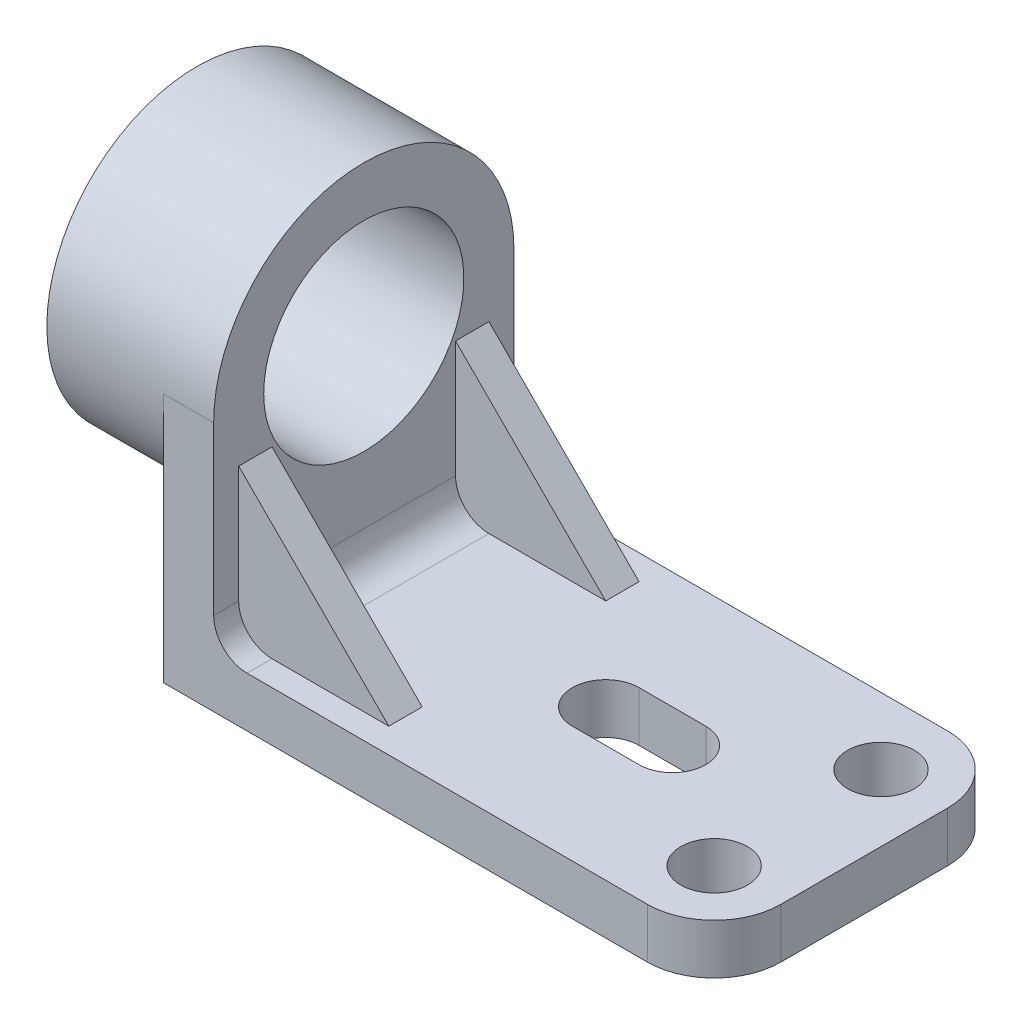
ISO-10303-21;
HEADER;
FILE_DESCRIPTION(('STEP AP214'),'2;1');
FILE_NAME('part.step','',(''),(''),'','','');
FILE_SCHEMA(('AUTOMOTIVE_DESIGN { 1 0 10303 214 1 1 1 1 }'));
ENDSEC;
DATA;
#1=APPLICATION_CONTEXT('core data for automotive mechanical design processes');
#2=APPLICATION_PROTOCOL_DEFINITION('international standard','automotive_design',2000,#1);
#3=PRODUCT_CONTEXT('',#1,'mechanical');
#4=PRODUCT('Part','Part','',(#3));
#5=PRODUCT_RELATED_PRODUCT_CATEGORY('part','',(#4));
#6=PRODUCT_DEFINITION_FORMATION('','',#4);
#7=PRODUCT_DEFINITION_CONTEXT('part definition',#1,'design');
#8=PRODUCT_DEFINITION('design','',#6,#7);
#9=PRODUCT_DEFINITION_SHAPE('','',#8);
#10=(LENGTH_UNIT() NAMED_UNIT(*) SI_UNIT(.MILLI.,.METRE.));
#11=(NAMED_UNIT(*) PLANE_ANGLE_UNIT() SI_UNIT($,.RADIAN.));
#12=(NAMED_UNIT(*) SI_UNIT($,.STERADIAN.) SOLID_ANGLE_UNIT());
#13=UNCERTAINTY_MEASURE_WITH_UNIT(LENGTH_MEASURE(1.E-05),#10,'distance_accuracy_value','');
#14=(GEOMETRIC_REPRESENTATION_CONTEXT(3) GLOBAL_UNCERTAINTY_ASSIGNED_CONTEXT((#13)) GLOBAL_UNIT_ASSIGNED_CONTEXT((#10,
#11,#12)) REPRESENTATION_CONTEXT('',''));
#15=CARTESIAN_POINT('',(0.,0.,0.));
#16=DIRECTION('',(0.,0.,1.));
#17=DIRECTION('',(1.,0.,0.));
#18=AXIS2_PLACEMENT_3D('',#15,#16,#17);
#19=CARTESIAN_POINT('',(22.,6.,10.));
#20=DIRECTION('',(0.,1.,0.));
#21=DIRECTION('',(0.,0.,1.));
#22=AXIS2_PLACEMENT_3D('',#19,#20,#21);
#23=PLANE('',#22);
#24=CARTESIAN_POINT('',(22.,6.,10.));
#25=DIRECTION('',(0.,1.,0.));
#26=DIRECTION('',(0.,0.,1.));
#27=AXIS2_PLACEMENT_3D('',#24,#25,#26);
#28=CIRCLE('',#27,4.00000000000001);
#29=CARTESIAN_POINT('',(22.,6.,14.));
#30=VERTEX_POINT('',#29);
#31=EDGE_CURVE('E315',#30,#30,#28,.T.);
#32=ORIENTED_EDGE('',*,*,#31,.F.);
#33=EDGE_LOOP('',(#32));
#34=FACE_BOUND('',#33,.T.);
#35=CARTESIAN_POINT('',(22.,6.,-10.));
#36=DIRECTION('',(0.,1.,0.));
#37=DIRECTION('',(0.,0.,-1.));
#38=AXIS2_PLACEMENT_3D('',#35,#36,#37);
#39=CIRCLE('',#38,4.00000000000001);
#40=CARTESIAN_POINT('',(22.,6.,-14.));
#41=VERTEX_POINT('',#40);
#42=EDGE_CURVE('E309',#41,#41,#39,.T.);
#43=ORIENTED_EDGE('',*,*,#42,.F.);
#44=EDGE_LOOP('',(#43));
#45=FACE_BOUND('',#44,.T.);
#46=DIRECTION('',(1.,0.,0.));
#47=VECTOR('',#46,1.);
#48=CARTESIAN_POINT('',(-0.999999999999997,6.,4.));
#49=LINE('',#48,#47);
#50=CARTESIAN_POINT('',(-0.999999999999997,6.,4.));
#51=VERTEX_POINT('',#50);
#52=CARTESIAN_POINT('',(7.,6.,4.));
#53=VERTEX_POINT('',#52);
#54=EDGE_CURVE('E280',#51,#53,#49,.T.);
#55=ORIENTED_EDGE('',*,*,#54,.F.);
#56=CARTESIAN_POINT('',(-0.999999999999997,6.,0.));
#57=DIRECTION('',(0.,1.,0.));
#58=DIRECTION('',(0.,0.,1.));
#59=AXIS2_PLACEMENT_3D('',#56,#57,#58);
#60=CIRCLE('',#59,4.);
#61=CARTESIAN_POINT('',(-0.999999999999997,6.,-4.));
#62=VERTEX_POINT('',#61);
#63=EDGE_CURVE('E278',#62,#51,#60,.T.);
#64=ORIENTED_EDGE('',*,*,#63,.F.);
#65=DIRECTION('',(-1.,0.,0.));
#66=VECTOR('',#65,1.);
#67=CARTESIAN_POINT('',(-0.999999999999997,6.,-4.));
#68=LINE('',#67,#66);
#69=CARTESIAN_POINT('',(7.,6.,-4.));
#70=VERTEX_POINT('',#69);
#71=EDGE_CURVE('E286',#70,#62,#68,.T.);
#72=ORIENTED_EDGE('',*,*,#71,.F.);
#73=CARTESIAN_POINT('',(7.,6.,0.));
#74=DIRECTION('',(0.,1.,0.));
#75=DIRECTION('',(0.,0.,1.));
#76=AXIS2_PLACEMENT_3D('',#73,#74,#75);
#77=CIRCLE('',#76,4.);
#78=EDGE_CURVE('E283',#53,#70,#77,.T.);
#79=ORIENTED_EDGE('',*,*,#78,.F.);
#80=EDGE_LOOP('',(#55,#64,#72,#79));
#81=FACE_BOUND('',#80,.T.);
#82=DIRECTION('',(0.,0.,-1.));
#83=VECTOR('',#82,1.);
#84=CARTESIAN_POINT('',(-12.,6.,-11.));
#85=LINE('',#84,#83);
#86=CARTESIAN_POINT('',(-12.,6.,-11.));
#87=VERTEX_POINT('',#86);
#88=CARTESIAN_POINT('',(-12.,6.,-15.));
#89=VERTEX_POINT('',#88);
#90=EDGE_CURVE('E230',#87,#89,#85,.T.);
#91=ORIENTED_EDGE('',*,*,#90,.F.);
#92=DIRECTION('',(1.,0.,0.));
#93=VECTOR('',#92,1.);
#94=CARTESIAN_POINT('',(-26.,6.,-11.));
#95=LINE('',#94,#93);
#96=CARTESIAN_POINT('',(-26.,6.,-11.));
#97=VERTEX_POINT('',#96);
#98=EDGE_CURVE('E387',#97,#87,#95,.T.);
#99=ORIENTED_EDGE('',*,*,#98,.F.);
#100=DIRECTION('',(0.,0.,1.));
#101=VECTOR('',#100,1.);
#102=CARTESIAN_POINT('',(-26.,6.,10.));
#103=LINE('',#102,#101);
#104=CARTESIAN_POINT('',(-26.,6.,11.));
#105=VERTEX_POINT('',#104);
#106=EDGE_CURVE('E194',#97,#105,#103,.T.);
#107=ORIENTED_EDGE('',*,*,#106,.T.);
#108=DIRECTION('',(1.,0.,0.));
#109=VECTOR('',#108,1.);
#110=CARTESIAN_POINT('',(-26.,6.,11.));
#111=LINE('',#110,#109);
#112=CARTESIAN_POINT('',(-12.,6.,11.));
#113=VERTEX_POINT('',#112);
#114=EDGE_CURVE('E394',#105,#113,#111,.T.);
#115=ORIENTED_EDGE('',*,*,#114,.T.);
#116=DIRECTION('',(0.,0.,1.));
#117=VECTOR('',#116,1.);
#118=CARTESIAN_POINT('',(-12.,6.,11.));
#119=LINE('',#118,#117);
#120=CARTESIAN_POINT('',(-12.,6.,15.));
#121=VERTEX_POINT('',#120);
#122=EDGE_CURVE('E245',#113,#121,#119,.T.);
#123=ORIENTED_EDGE('',*,*,#122,.T.);
#124=DIRECTION('',(1.,0.,0.));
#125=VECTOR('',#124,1.);
#126=CARTESIAN_POINT('',(-26.,6.,15.));
#127=LINE('',#126,#125);
#128=CARTESIAN_POINT('',(-26.,6.,15.));
#129=VERTEX_POINT('',#128);
#130=EDGE_CURVE('E229',#129,#121,#127,.T.);
#131=ORIENTED_EDGE('',*,*,#130,.F.);
#132=CARTESIAN_POINT('',(-26.,6.,18.));
#133=VERTEX_POINT('',#132);
#134=EDGE_CURVE('E226',#129,#133,#103,.T.);
#135=ORIENTED_EDGE('',*,*,#134,.T.);
#136=DIRECTION('',(1.,0.,0.));
#137=VECTOR('',#136,1.);
#138=CARTESIAN_POINT('',(-30.,6.,18.));
#139=LINE('',#138,#137);
#140=CARTESIAN_POINT('',(22.,6.,18.));
#141=VERTEX_POINT('',#140);
#142=EDGE_CURVE('E216',#133,#141,#139,.T.);
#143=ORIENTED_EDGE('',*,*,#142,.T.);
#144=CARTESIAN_POINT('',(22.,6.,10.));
#145=DIRECTION('',(0.,1.,0.));
#146=DIRECTION('',(0.,0.,1.));
#147=AXIS2_PLACEMENT_3D('',#144,#145,#146);
#148=CIRCLE('',#147,7.99999999999999);
#149=CARTESIAN_POINT('',(30.,6.,9.99999999999999));
#150=VERTEX_POINT('',#149);
#151=EDGE_CURVE('E322',#141,#150,#148,.T.);
#152=ORIENTED_EDGE('',*,*,#151,.T.);
#153=DIRECTION('',(0.,0.,-1.));
#154=VECTOR('',#153,1.);
#155=CARTESIAN_POINT('',(30.,6.,-9.99999999999999));
#156=LINE('',#155,#154);
#157=CARTESIAN_POINT('',(30.,6.,-9.99999999999999));
#158=VERTEX_POINT('',#157);
#159=EDGE_CURVE('E325',#150,#158,#156,.T.);
#160=ORIENTED_EDGE('',*,*,#159,.T.);
#161=CARTESIAN_POINT('',(22.,6.,-10.));
#162=DIRECTION('',(0.,1.,0.));
#163=DIRECTION('',(0.,0.,-1.));
#164=AXIS2_PLACEMENT_3D('',#161,#162,#163);
#165=CIRCLE('',#164,7.99999999999999);
#166=CARTESIAN_POINT('',(22.,6.,-18.));
#167=VERTEX_POINT('',#166);
#168=EDGE_CURVE('E327',#158,#167,#165,.T.);
#169=ORIENTED_EDGE('',*,*,#168,.T.);
#170=DIRECTION('',(-1.,0.,0.));
#171=VECTOR('',#170,1.);
#172=CARTESIAN_POINT('',(-30.,6.,-18.));
#173=LINE('',#172,#171);
#174=CARTESIAN_POINT('',(-26.,6.,-18.));
#175=VERTEX_POINT('',#174);
#176=EDGE_CURVE('E329',#167,#175,#173,.T.);
#177=ORIENTED_EDGE('',*,*,#176,.T.);
#178=CARTESIAN_POINT('',(-26.,6.,-15.));
#179=VERTEX_POINT('',#178);
#180=EDGE_CURVE('E205',#175,#179,#103,.T.);
#181=ORIENTED_EDGE('',*,*,#180,.T.);
#182=DIRECTION('',(1.,0.,0.));
#183=VECTOR('',#182,1.);
#184=CARTESIAN_POINT('',(-26.,6.,-15.));
#185=LINE('',#184,#183);
#186=EDGE_CURVE('E48',#179,#89,#185,.T.);
#187=ORIENTED_EDGE('',*,*,#186,.T.);
#188=EDGE_LOOP('',(#91,#99,#107,#115,#123,#131,#135,#143,#152,#160,#169,#177,#181,#187));
#189=FACE_BOUND('',#188,.T.);
#190=ADVANCED_FACE('F33',(#34,#45,#81,#189),#23,.T.);
#191=CARTESIAN_POINT('',(-30.,30.,0.));
#192=DIRECTION('',(-1.,0.,0.));
#193=DIRECTION('',(0.,0.,1.));
#194=AXIS2_PLACEMENT_3D('',#191,#192,#193);
#195=PLANE('',#194);
#196=CARTESIAN_POINT('',(-30.,30.,0.));
#197=DIRECTION('',(-1.,0.,0.));
#198=DIRECTION('',(0.,0.,1.));
#199=AXIS2_PLACEMENT_3D('',#196,#197,#198);
#200=CIRCLE('',#199,12.);
#201=CARTESIAN_POINT('',(-30.,30.,12.));
#202=VERTEX_POINT('',#201);
#203=EDGE_CURVE('E223',#202,#202,#200,.T.);
#204=ORIENTED_EDGE('',*,*,#203,.T.);
#205=EDGE_LOOP('',(#204));
#206=FACE_BOUND('',#205,.T.);
#207=DIRECTION('',(0.,-1.,0.));
#208=VECTOR('',#207,1.);
#209=CARTESIAN_POINT('',(-30.,10.,-11.));
#210=LINE('',#209,#208);
#211=CARTESIAN_POINT('',(-30.,24.0000000000001,-11.));
#212=VERTEX_POINT('',#211);
#213=CARTESIAN_POINT('',(-30.,10.,-11.));
#214=VERTEX_POINT('',#213);
#215=EDGE_CURVE('E176',#212,#214,#210,.T.);
#216=ORIENTED_EDGE('',*,*,#215,.F.);
#217=DIRECTION('',(0.,0.,-1.));
#218=VECTOR('',#217,1.);
#219=CARTESIAN_POINT('',(-30.,24.0000000000001,-11.));
#220=LINE('',#219,#218);
#221=CARTESIAN_POINT('',(-30.,24.0000000000001,-15.));
#222=VERTEX_POINT('',#221);
#223=EDGE_CURVE('E234',#212,#222,#220,.T.);
#224=ORIENTED_EDGE('',*,*,#223,.T.);
#225=DIRECTION('',(0.,-1.,0.));
#226=VECTOR('',#225,1.);
#227=CARTESIAN_POINT('',(-30.,10.,-15.));
#228=LINE('',#227,#226);
#229=CARTESIAN_POINT('',(-30.,10.,-15.));
#230=VERTEX_POINT('',#229);
#231=EDGE_CURVE('E382',#222,#230,#228,.T.);
#232=ORIENTED_EDGE('',*,*,#231,.T.);
#233=DIRECTION('',(0.,0.,1.));
#234=VECTOR('',#233,1.);
#235=CARTESIAN_POINT('',(-30.,10.,0.));
#236=LINE('',#235,#234);
#237=CARTESIAN_POINT('',(-30.,10.,-18.));
#238=VERTEX_POINT('',#237);
#239=EDGE_CURVE('E202',#230,#238,#236,.F.);
#240=ORIENTED_EDGE('',*,*,#239,.T.);
#241=DIRECTION('',(0.,-1.,0.));
#242=VECTOR('',#241,1.);
#243=CARTESIAN_POINT('',(-30.,0.,-18.));
#244=LINE('',#243,#242);
#245=CARTESIAN_POINT('',(-30.,30.,-18.));
#246=VERTEX_POINT('',#245);
#247=EDGE_CURVE('E263',#246,#238,#244,.T.);
#248=ORIENTED_EDGE('',*,*,#247,.F.);
#249=CARTESIAN_POINT('',(-30.,30.,0.));
#250=DIRECTION('',(-1.,0.,0.));
#251=DIRECTION('',(0.,0.,1.));
#252=AXIS2_PLACEMENT_3D('',#249,#250,#251);
#253=CIRCLE('',#252,18.);
#254=CARTESIAN_POINT('',(-30.,30.,18.));
#255=VERTEX_POINT('',#254);
#256=EDGE_CURVE('E222',#255,#246,#253,.T.);
#257=ORIENTED_EDGE('',*,*,#256,.F.);
#258=DIRECTION('',(0.,1.,0.));
#259=VECTOR('',#258,1.);
#260=CARTESIAN_POINT('',(-30.,0.,18.));
#261=LINE('',#260,#259);
#262=CARTESIAN_POINT('',(-30.,10.,18.));
#263=VERTEX_POINT('',#262);
#264=EDGE_CURVE('E213',#263,#255,#261,.T.);
#265=ORIENTED_EDGE('',*,*,#264,.F.);
#266=CARTESIAN_POINT('',(-30.,10.,15.));
#267=VERTEX_POINT('',#266);
#268=EDGE_CURVE('E201',#263,#267,#236,.F.);
#269=ORIENTED_EDGE('',*,*,#268,.T.);
#270=DIRECTION('',(0.,-1.,0.));
#271=VECTOR('',#270,1.);
#272=CARTESIAN_POINT('',(-30.,10.,15.));
#273=LINE('',#272,#271);
#274=CARTESIAN_POINT('',(-30.,24.0000000000001,15.));
#275=VERTEX_POINT('',#274);
#276=EDGE_CURVE('E56',#275,#267,#273,.T.);
#277=ORIENTED_EDGE('',*,*,#276,.F.);
#278=DIRECTION('',(0.,0.,1.));
#279=VECTOR('',#278,1.);
#280=CARTESIAN_POINT('',(-30.,24.0000000000001,11.));
#281=LINE('',#280,#279);
#282=CARTESIAN_POINT('',(-30.,24.0000000000001,11.));
#283=VERTEX_POINT('',#282);
#284=EDGE_CURVE('E242',#283,#275,#281,.T.);
#285=ORIENTED_EDGE('',*,*,#284,.F.);
#286=DIRECTION('',(0.,-1.,0.));
#287=VECTOR('',#286,1.);
#288=CARTESIAN_POINT('',(-30.,10.,11.));
#289=LINE('',#288,#287);
#290=CARTESIAN_POINT('',(-30.,10.,11.));
#291=VERTEX_POINT('',#290);
#292=EDGE_CURVE('E200',#283,#291,#289,.T.);
#293=ORIENTED_EDGE('',*,*,#292,.T.);
#294=EDGE_CURVE('E193',#291,#214,#236,.F.);
#295=ORIENTED_EDGE('',*,*,#294,.T.);
#296=EDGE_LOOP('',(#216,#224,#232,#240,#248,#257,#265,#269,#277,#285,#293,#295));
#297=FACE_BOUND('',#296,.T.);
#298=ADVANCED_FACE('F197',(#206,#297),#195,.F.);
#299=CARTESIAN_POINT('',(-26.,10.,10.));
#300=DIRECTION('',(0.,0.,1.));
#301=DIRECTION('',(1.,0.,0.));
#302=AXIS2_PLACEMENT_3D('',#299,#300,#301);
#303=CYLINDRICAL_SURFACE('',#302,4.);
#304=CARTESIAN_POINT('',(-26.,10.,-11.));
#305=DIRECTION('',(0.,0.,1.));
#306=DIRECTION('',(1.,0.,0.));
#307=AXIS2_PLACEMENT_3D('',#304,#305,#306);
#308=CIRCLE('',#307,4.);
#309=EDGE_CURVE('E179',#214,#97,#308,.T.);
#310=ORIENTED_EDGE('',*,*,#309,.F.);
#311=ORIENTED_EDGE('',*,*,#294,.F.);
#312=CARTESIAN_POINT('',(-26.,10.,11.));
#313=DIRECTION('',(0.,0.,1.));
#314=DIRECTION('',(1.,0.,0.));
#315=AXIS2_PLACEMENT_3D('',#312,#313,#314);
#316=CIRCLE('',#315,4.);
#317=EDGE_CURVE('E241',#291,#105,#316,.T.);
#318=ORIENTED_EDGE('',*,*,#317,.T.);
#319=ORIENTED_EDGE('',*,*,#106,.F.);
#320=EDGE_LOOP('',(#310,#311,#318,#319));
#321=FACE_BOUND('',#320,.T.);
#322=ADVANCED_FACE('F191',(#321),#303,.F.);
#323=ORIENTED_EDGE('',*,*,#239,.F.);
#324=CARTESIAN_POINT('',(-26.,10.,-15.));
#325=DIRECTION('',(0.,0.,1.));
#326=DIRECTION('',(1.,0.,0.));
#327=AXIS2_PLACEMENT_3D('',#324,#325,#326);
#328=CIRCLE('',#327,4.);
#329=EDGE_CURVE('E379',#230,#179,#328,.T.);
#330=ORIENTED_EDGE('',*,*,#329,.T.);
#331=ORIENTED_EDGE('',*,*,#180,.F.);
#332=CARTESIAN_POINT('',(-26.,10.,-18.));
#333=DIRECTION('',(0.,0.,1.));
#334=DIRECTION('',(1.,0.,0.));
#335=AXIS2_PLACEMENT_3D('',#332,#333,#334);
#336=CIRCLE('',#335,4.);
#337=EDGE_CURVE('E11',#238,#175,#336,.T.);
#338=ORIENTED_EDGE('',*,*,#337,.F.);
#339=EDGE_LOOP('',(#323,#330,#331,#338));
#340=FACE_BOUND('',#339,.T.);
#341=ADVANCED_FACE('F378',(#340),#303,.F.);
#342=CARTESIAN_POINT('',(22.,0.,10.));
#343=DIRECTION('',(0.,1.,0.));
#344=DIRECTION('',(0.,0.,1.));
#345=AXIS2_PLACEMENT_3D('',#342,#343,#344);
#346=PLANE('',#345);
#347=CARTESIAN_POINT('',(22.,0.,-10.));
#348=DIRECTION('',(0.,1.,0.));
#349=DIRECTION('',(0.,0.,-1.));
#350=AXIS2_PLACEMENT_3D('',#347,#348,#349);
#351=CIRCLE('',#350,4.00000000000001);
#352=CARTESIAN_POINT('',(22.,0.,-14.));
#353=VERTEX_POINT('',#352);
#354=EDGE_CURVE('E308',#353,#353,#351,.T.);
#355=ORIENTED_EDGE('',*,*,#354,.T.);
#356=EDGE_LOOP('',(#355));
#357=FACE_BOUND('',#356,.T.);
#358=CARTESIAN_POINT('',(22.,0.,10.));
#359=DIRECTION('',(0.,1.,0.));
#360=DIRECTION('',(0.,0.,1.));
#361=AXIS2_PLACEMENT_3D('',#358,#359,#360);
#362=CIRCLE('',#361,4.00000000000001);
#363=CARTESIAN_POINT('',(22.,0.,14.));
#364=VERTEX_POINT('',#363);
#365=EDGE_CURVE('E312',#364,#364,#362,.T.);
#366=ORIENTED_EDGE('',*,*,#365,.T.);
#367=EDGE_LOOP('',(#366));
#368=FACE_BOUND('',#367,.T.);
#369=DIRECTION('',(1.,0.,0.));
#370=VECTOR('',#369,1.);
#371=CARTESIAN_POINT('',(-30.,0.,18.));
#372=LINE('',#371,#370);
#373=CARTESIAN_POINT('',(-36.,0.,18.));
#374=VERTEX_POINT('',#373);
#375=CARTESIAN_POINT('',(22.,0.,18.));
#376=VERTEX_POINT('',#375);
#377=EDGE_CURVE('E318',#374,#376,#372,.T.);
#378=ORIENTED_EDGE('',*,*,#377,.F.);
#379=DIRECTION('',(0.,0.,1.));
#380=VECTOR('',#379,1.);
#381=CARTESIAN_POINT('',(-36.,0.,-18.));
#382=LINE('',#381,#380);
#383=CARTESIAN_POINT('',(-36.,0.,-18.));
#384=VERTEX_POINT('',#383);
#385=EDGE_CURVE('E259',#384,#374,#382,.T.);
#386=ORIENTED_EDGE('',*,*,#385,.F.);
#387=DIRECTION('',(-1.,0.,0.));
#388=VECTOR('',#387,1.);
#389=CARTESIAN_POINT('',(-30.,0.,-18.));
#390=LINE('',#389,#388);
#391=CARTESIAN_POINT('',(22.,0.,-18.));
#392=VERTEX_POINT('',#391);
#393=EDGE_CURVE('E323',#392,#384,#390,.T.);
#394=ORIENTED_EDGE('',*,*,#393,.F.);
#395=CARTESIAN_POINT('',(22.,0.,-10.));
#396=DIRECTION('',(0.,1.,0.));
#397=DIRECTION('',(0.,0.,-1.));
#398=AXIS2_PLACEMENT_3D('',#395,#396,#397);
#399=CIRCLE('',#398,7.99999999999999);
#400=CARTESIAN_POINT('',(30.,0.,-9.99999999999999));
#401=VERTEX_POINT('',#400);
#402=EDGE_CURVE('E338',#401,#392,#399,.T.);
#403=ORIENTED_EDGE('',*,*,#402,.F.);
#404=DIRECTION('',(0.,0.,-1.));
#405=VECTOR('',#404,1.);
#406=CARTESIAN_POINT('',(30.,0.,-9.99999999999999));
#407=LINE('',#406,#405);
#408=CARTESIAN_POINT('',(30.,0.,9.99999999999999));
#409=VERTEX_POINT('',#408);
#410=EDGE_CURVE('E336',#409,#401,#407,.T.);
#411=ORIENTED_EDGE('',*,*,#410,.F.);
#412=CARTESIAN_POINT('',(22.,0.,10.));
#413=DIRECTION('',(0.,1.,0.));
#414=DIRECTION('',(0.,0.,1.));
#415=AXIS2_PLACEMENT_3D('',#412,#413,#414);
#416=CIRCLE('',#415,7.99999999999999);
#417=EDGE_CURVE('E334',#376,#409,#416,.T.);
#418=ORIENTED_EDGE('',*,*,#417,.F.);
#419=EDGE_LOOP('',(#378,#386,#394,#403,#411,#418));
#420=FACE_BOUND('',#419,.T.);
#421=CARTESIAN_POINT('',(-0.999999999999997,0.,0.));
#422=DIRECTION('',(0.,1.,0.));
#423=DIRECTION('',(0.,0.,1.));
#424=AXIS2_PLACEMENT_3D('',#421,#422,#423);
#425=CIRCLE('',#424,4.);
#426=CARTESIAN_POINT('',(-0.999999999999997,0.,-4.));
#427=VERTEX_POINT('',#426);
#428=CARTESIAN_POINT('',(-0.999999999999997,0.,4.));
#429=VERTEX_POINT('',#428);
#430=EDGE_CURVE('E277',#427,#429,#425,.T.);
#431=ORIENTED_EDGE('',*,*,#430,.T.);
#432=DIRECTION('',(1.,0.,0.));
#433=VECTOR('',#432,1.);
#434=CARTESIAN_POINT('',(-0.999999999999997,0.,4.));
#435=LINE('',#434,#433);
#436=CARTESIAN_POINT('',(7.,0.,4.));
#437=VERTEX_POINT('',#436);
#438=EDGE_CURVE('E291',#429,#437,#435,.T.);
#439=ORIENTED_EDGE('',*,*,#438,.T.);
#440=CARTESIAN_POINT('',(7.,0.,0.));
#441=DIRECTION('',(0.,1.,0.));
#442=DIRECTION('',(0.,0.,1.));
#443=AXIS2_PLACEMENT_3D('',#440,#441,#442);
#444=CIRCLE('',#443,4.);
#445=CARTESIAN_POINT('',(7.,0.,-4.));
#446=VERTEX_POINT('',#445);
#447=EDGE_CURVE('E294',#437,#446,#444,.T.);
#448=ORIENTED_EDGE('',*,*,#447,.T.);
#449=DIRECTION('',(-1.,0.,0.));
#450=VECTOR('',#449,1.);
#451=CARTESIAN_POINT('',(-0.999999999999997,0.,-4.));
#452=LINE('',#451,#450);
#453=EDGE_CURVE('E281',#446,#427,#452,.T.);
#454=ORIENTED_EDGE('',*,*,#453,.T.);
#455=EDGE_LOOP('',(#431,#439,#448,#454));
#456=FACE_BOUND('',#455,.T.);
#457=ADVANCED_FACE('F356',(#357,#368,#420,#456),#346,.F.);
#458=CARTESIAN_POINT('',(-30.,6.,18.));
#459=DIRECTION('',(0.,0.,-1.));
#460=DIRECTION('',(-1.,0.,0.));
#461=AXIS2_PLACEMENT_3D('',#458,#459,#460);
#462=PLANE('',#461);
#463=ORIENTED_EDGE('',*,*,#377,.T.);
#464=DIRECTION('',(0.,-1.,0.));
#465=VECTOR('',#464,1.);
#466=CARTESIAN_POINT('',(22.,6.,18.));
#467=LINE('',#466,#465);
#468=EDGE_CURVE('E256',#141,#376,#467,.T.);
#469=ORIENTED_EDGE('',*,*,#468,.F.);
#470=ORIENTED_EDGE('',*,*,#142,.F.);
#471=CARTESIAN_POINT('',(-26.,10.,18.));
#472=DIRECTION('',(0.,0.,-1.));
#473=DIRECTION('',(-1.,0.,0.));
#474=AXIS2_PLACEMENT_3D('',#471,#472,#473);
#475=CIRCLE('',#474,4.);
#476=EDGE_CURVE('E41',#133,#263,#475,.T.);
#477=ORIENTED_EDGE('',*,*,#476,.T.);
#478=ORIENTED_EDGE('',*,*,#264,.T.);
#479=DIRECTION('',(1.,0.,0.));
#480=VECTOR('',#479,1.);
#481=CARTESIAN_POINT('',(-36.,30.,18.));
#482=LINE('',#481,#480);
#483=CARTESIAN_POINT('',(-36.,30.,18.));
#484=VERTEX_POINT('',#483);
#485=EDGE_CURVE('E275',#484,#255,#482,.T.);
#486=ORIENTED_EDGE('',*,*,#485,.F.);
#487=DIRECTION('',(0.,1.,0.));
#488=VECTOR('',#487,1.);
#489=CARTESIAN_POINT('',(-36.,0.,18.));
#490=LINE('',#489,#488);
#491=EDGE_CURVE('E262',#374,#484,#490,.T.);
#492=ORIENTED_EDGE('',*,*,#491,.F.);
#493=EDGE_LOOP('',(#463,#469,#470,#477,#478,#486,#492));
#494=FACE_BOUND('',#493,.T.);
#495=ADVANCED_FACE('F212',(#494),#462,.F.);
#496=CARTESIAN_POINT('',(22.,6.,10.));
#497=DIRECTION('',(0.,-1.,0.));
#498=DIRECTION('',(0.,0.,-1.));
#499=AXIS2_PLACEMENT_3D('',#496,#497,#498);
#500=CYLINDRICAL_SURFACE('',#499,7.99999999999999);
#501=ORIENTED_EDGE('',*,*,#417,.T.);
#502=DIRECTION('',(0.,-1.,0.));
#503=VECTOR('',#502,1.);
#504=CARTESIAN_POINT('',(30.,6.,9.99999999999999));
#505=LINE('',#504,#503);
#506=EDGE_CURVE('E346',#150,#409,#505,.T.);
#507=ORIENTED_EDGE('',*,*,#506,.F.);
#508=ORIENTED_EDGE('',*,*,#151,.F.);
#509=ORIENTED_EDGE('',*,*,#468,.T.);
#510=EDGE_LOOP('',(#501,#507,#508,#509));
#511=FACE_BOUND('',#510,.T.);
#512=ADVANCED_FACE('F352',(#511),#500,.T.);
#513=CARTESIAN_POINT('',(30.,6.,-9.99999999999999));
#514=DIRECTION('',(-1.,0.,0.));
#515=DIRECTION('',(0.,0.,1.));
#516=AXIS2_PLACEMENT_3D('',#513,#514,#515);
#517=PLANE('',#516);
#518=ORIENTED_EDGE('',*,*,#410,.T.);
#519=DIRECTION('',(0.,-1.,0.));
#520=VECTOR('',#519,1.);
#521=CARTESIAN_POINT('',(30.,6.,-9.99999999999999));
#522=LINE('',#521,#520);
#523=EDGE_CURVE('E343',#158,#401,#522,.T.);
#524=ORIENTED_EDGE('',*,*,#523,.F.);
#525=ORIENTED_EDGE('',*,*,#159,.F.);
#526=ORIENTED_EDGE('',*,*,#506,.T.);
#527=EDGE_LOOP('',(#518,#524,#525,#526));
#528=FACE_BOUND('',#527,.T.);
#529=ADVANCED_FACE('F364',(#528),#517,.F.);
#530=CARTESIAN_POINT('',(22.,6.,-10.));
#531=DIRECTION('',(0.,-1.,0.));
#532=DIRECTION('',(0.,0.,-1.));
#533=AXIS2_PLACEMENT_3D('',#530,#531,#532);
#534=CYLINDRICAL_SURFACE('',#533,7.99999999999999);
#535=ORIENTED_EDGE('',*,*,#402,.T.);
#536=DIRECTION('',(0.,-1.,0.));
#537=VECTOR('',#536,1.);
#538=CARTESIAN_POINT('',(22.,6.,-18.));
#539=LINE('',#538,#537);
#540=EDGE_CURVE('E332',#167,#392,#539,.T.);
#541=ORIENTED_EDGE('',*,*,#540,.F.);
#542=ORIENTED_EDGE('',*,*,#168,.F.);
#543=ORIENTED_EDGE('',*,*,#523,.T.);
#544=EDGE_LOOP('',(#535,#541,#542,#543));
#545=FACE_BOUND('',#544,.T.);
#546=ADVANCED_FACE('F368',(#545),#534,.T.);
#547=CARTESIAN_POINT('',(-30.,6.,-18.));
#548=DIRECTION('',(0.,0.,1.));
#549=DIRECTION('',(1.,0.,0.));
#550=AXIS2_PLACEMENT_3D('',#547,#548,#549);
#551=PLANE('',#550);
#552=ORIENTED_EDGE('',*,*,#393,.T.);
#553=DIRECTION('',(0.,-1.,0.));
#554=VECTOR('',#553,1.);
#555=CARTESIAN_POINT('',(-36.,0.,-18.));
#556=LINE('',#555,#554);
#557=CARTESIAN_POINT('',(-36.,30.,-18.));
#558=VERTEX_POINT('',#557);
#559=EDGE_CURVE('E266',#558,#384,#556,.T.);
#560=ORIENTED_EDGE('',*,*,#559,.F.);
#561=DIRECTION('',(1.,0.,0.));
#562=VECTOR('',#561,1.);
#563=CARTESIAN_POINT('',(-36.,30.,-18.));
#564=LINE('',#563,#562);
#565=EDGE_CURVE('E268',#558,#246,#564,.T.);
#566=ORIENTED_EDGE('',*,*,#565,.T.);
#567=ORIENTED_EDGE('',*,*,#247,.T.);
#568=ORIENTED_EDGE('',*,*,#337,.T.);
#569=ORIENTED_EDGE('',*,*,#176,.F.);
#570=ORIENTED_EDGE('',*,*,#540,.T.);
#571=EDGE_LOOP('',(#552,#560,#566,#567,#568,#569,#570));
#572=FACE_BOUND('',#571,.T.);
#573=ADVANCED_FACE('F430',(#572),#551,.F.);
#574=CARTESIAN_POINT('',(22.,6.,10.));
#575=DIRECTION('',(0.,-1.,0.));
#576=DIRECTION('',(0.,0.,-1.));
#577=AXIS2_PLACEMENT_3D('',#574,#575,#576);
#578=CYLINDRICAL_SURFACE('',#577,4.00000000000001);
#579=ORIENTED_EDGE('',*,*,#31,.T.);
#580=EDGE_LOOP('',(#579));
#581=FACE_BOUND('',#580,.T.);
#582=ORIENTED_EDGE('',*,*,#365,.F.);
#583=EDGE_LOOP('',(#582));
#584=FACE_BOUND('',#583,.T.);
#585=ADVANCED_FACE('F425',(#581,#584),#578,.F.);
#586=CARTESIAN_POINT('',(22.,6.,-10.));
#587=DIRECTION('',(0.,-1.,0.));
#588=DIRECTION('',(0.,0.,-1.));
#589=AXIS2_PLACEMENT_3D('',#586,#587,#588);
#590=CYLINDRICAL_SURFACE('',#589,4.00000000000001);
#591=ORIENTED_EDGE('',*,*,#42,.T.);
#592=EDGE_LOOP('',(#591));
#593=FACE_BOUND('',#592,.T.);
#594=ORIENTED_EDGE('',*,*,#354,.F.);
#595=EDGE_LOOP('',(#594));
#596=FACE_BOUND('',#595,.T.);
#597=ADVANCED_FACE('F469',(#593,#596),#590,.F.);
#598=CARTESIAN_POINT('',(-0.999999999999997,6.,0.));
#599=DIRECTION('',(0.,-1.,0.));
#600=DIRECTION('',(0.,0.,-1.));
#601=AXIS2_PLACEMENT_3D('',#598,#599,#600);
#602=CYLINDRICAL_SURFACE('',#601,4.);
#603=ORIENTED_EDGE('',*,*,#430,.F.);
#604=DIRECTION('',(0.,-1.,0.));
#605=VECTOR('',#604,1.);
#606=CARTESIAN_POINT('',(-0.999999999999997,6.,-4.));
#607=LINE('',#606,#605);
#608=EDGE_CURVE('E288',#62,#427,#607,.T.);
#609=ORIENTED_EDGE('',*,*,#608,.F.);
#610=ORIENTED_EDGE('',*,*,#63,.T.);
#611=DIRECTION('',(0.,-1.,0.));
#612=VECTOR('',#611,1.);
#613=CARTESIAN_POINT('',(-0.999999999999997,6.,4.));
#614=LINE('',#613,#612);
#615=EDGE_CURVE('E305',#51,#429,#614,.T.);
#616=ORIENTED_EDGE('',*,*,#615,.T.);
#617=EDGE_LOOP('',(#603,#609,#610,#616));
#618=FACE_BOUND('',#617,.T.);
#619=ADVANCED_FACE('F476',(#618),#602,.F.);
#620=CARTESIAN_POINT('',(-0.999999999999997,6.,4.));
#621=DIRECTION('',(0.,0.,-1.));
#622=DIRECTION('',(-1.,0.,0.));
#623=AXIS2_PLACEMENT_3D('',#620,#621,#622);
#624=PLANE('',#623);
#625=ORIENTED_EDGE('',*,*,#438,.F.);
#626=ORIENTED_EDGE('',*,*,#615,.F.);
#627=ORIENTED_EDGE('',*,*,#54,.T.);
#628=DIRECTION('',(0.,-1.,0.));
#629=VECTOR('',#628,1.);
#630=CARTESIAN_POINT('',(7.,6.,4.));
#631=LINE('',#630,#629);
#632=EDGE_CURVE('E303',#53,#437,#631,.T.);
#633=ORIENTED_EDGE('',*,*,#632,.T.);
#634=EDGE_LOOP('',(#625,#626,#627,#633));
#635=FACE_BOUND('',#634,.T.);
#636=ADVANCED_FACE('F483',(#635),#624,.T.);
#637=CARTESIAN_POINT('',(7.,6.,0.));
#638=DIRECTION('',(0.,-1.,0.));
#639=DIRECTION('',(0.,0.,-1.));
#640=AXIS2_PLACEMENT_3D('',#637,#638,#639);
#641=CYLINDRICAL_SURFACE('',#640,4.);
#642=ORIENTED_EDGE('',*,*,#447,.F.);
#643=ORIENTED_EDGE('',*,*,#632,.F.);
#644=ORIENTED_EDGE('',*,*,#78,.T.);
#645=DIRECTION('',(0.,-1.,0.));
#646=VECTOR('',#645,1.);
#647=CARTESIAN_POINT('',(7.,6.,-4.));
#648=LINE('',#647,#646);
#649=EDGE_CURVE('E301',#70,#446,#648,.T.);
#650=ORIENTED_EDGE('',*,*,#649,.T.);
#651=EDGE_LOOP('',(#642,#643,#644,#650));
#652=FACE_BOUND('',#651,.T.);
#653=ADVANCED_FACE('F491',(#652),#641,.F.);
#654=CARTESIAN_POINT('',(-0.999999999999997,6.,-4.));
#655=DIRECTION('',(0.,0.,1.));
#656=DIRECTION('',(1.,0.,0.));
#657=AXIS2_PLACEMENT_3D('',#654,#655,#656);
#658=PLANE('',#657);
#659=ORIENTED_EDGE('',*,*,#453,.F.);
#660=ORIENTED_EDGE('',*,*,#649,.F.);
#661=ORIENTED_EDGE('',*,*,#71,.T.);
#662=ORIENTED_EDGE('',*,*,#608,.T.);
#663=EDGE_LOOP('',(#659,#660,#661,#662));
#664=FACE_BOUND('',#663,.T.);
#665=ADVANCED_FACE('F499',(#664),#658,.T.);
#666=CARTESIAN_POINT('',(-36.,30.,0.));
#667=DIRECTION('',(-1.,0.,0.));
#668=DIRECTION('',(0.,0.,1.));
#669=AXIS2_PLACEMENT_3D('',#666,#667,#668);
#670=PLANE('',#669);
#671=CARTESIAN_POINT('',(-36.,30.,0.));
#672=DIRECTION('',(-1.,0.,0.));
#673=DIRECTION('',(0.,0.,1.));
#674=AXIS2_PLACEMENT_3D('',#671,#672,#673);
#675=CIRCLE('',#674,18.);
#676=EDGE_CURVE('E253',#558,#484,#675,.T.);
#677=ORIENTED_EDGE('',*,*,#676,.F.);
#678=ORIENTED_EDGE('',*,*,#559,.T.);
#679=ORIENTED_EDGE('',*,*,#385,.T.);
#680=ORIENTED_EDGE('',*,*,#491,.T.);
#681=EDGE_LOOP('',(#677,#678,#679,#680));
#682=FACE_BOUND('',#681,.T.);
#683=ADVANCED_FACE('F507',(#682),#670,.T.);
#684=CARTESIAN_POINT('',(-36.,30.,0.));
#685=DIRECTION('',(1.,0.,0.));
#686=DIRECTION('',(0.,0.,-1.));
#687=AXIS2_PLACEMENT_3D('',#684,#685,#686);
#688=CYLINDRICAL_SURFACE('',#687,18.);
#689=ORIENTED_EDGE('',*,*,#256,.T.);
#690=ORIENTED_EDGE('',*,*,#565,.F.);
#691=ORIENTED_EDGE('',*,*,#676,.T.);
#692=ORIENTED_EDGE('',*,*,#485,.T.);
#693=EDGE_LOOP('',(#689,#690,#691,#692));
#694=FACE_BOUND('',#693,.T.);
#695=CARTESIAN_POINT('',(-50.,30.,0.));
#696=DIRECTION('',(-1.,0.,0.));
#697=DIRECTION('',(0.,0.,1.));
#698=AXIS2_PLACEMENT_3D('',#695,#696,#697);
#699=CIRCLE('',#698,18.);
#700=CARTESIAN_POINT('',(-50.,30.,18.));
#701=VERTEX_POINT('',#700);
#702=EDGE_CURVE('E250',#701,#701,#699,.T.);
#703=ORIENTED_EDGE('',*,*,#702,.F.);
#704=EDGE_LOOP('',(#703));
#705=FACE_BOUND('',#704,.T.);
#706=ADVANCED_FACE('F515',(#694,#705),#688,.T.);
#707=CARTESIAN_POINT('',(-36.,30.,0.));
#708=DIRECTION('',(1.,0.,0.));
#709=DIRECTION('',(0.,0.,-1.));
#710=AXIS2_PLACEMENT_3D('',#707,#708,#709);
#711=CYLINDRICAL_SURFACE('',#710,12.);
#712=ORIENTED_EDGE('',*,*,#203,.F.);
#713=EDGE_LOOP('',(#712));
#714=FACE_BOUND('',#713,.T.);
#715=CARTESIAN_POINT('',(-50.,30.,0.));
#716=DIRECTION('',(-1.,0.,0.));
#717=DIRECTION('',(0.,0.,1.));
#718=AXIS2_PLACEMENT_3D('',#715,#716,#717);
#719=CIRCLE('',#718,12.);
#720=CARTESIAN_POINT('',(-50.,30.,12.));
#721=VERTEX_POINT('',#720);
#722=EDGE_CURVE('E244',#721,#721,#719,.T.);
#723=ORIENTED_EDGE('',*,*,#722,.T.);
#724=EDGE_LOOP('',(#723));
#725=FACE_BOUND('',#724,.T.);
#726=ADVANCED_FACE('F523',(#714,#725),#711,.F.);
#727=CARTESIAN_POINT('',(-50.,30.,0.));
#728=DIRECTION('',(-1.,0.,0.));
#729=DIRECTION('',(0.,0.,1.));
#730=AXIS2_PLACEMENT_3D('',#727,#728,#729);
#731=PLANE('',#730);
#732=ORIENTED_EDGE('',*,*,#702,.T.);
#733=EDGE_LOOP('',(#732));
#734=FACE_BOUND('',#733,.T.);
#735=ORIENTED_EDGE('',*,*,#722,.F.);
#736=EDGE_LOOP('',(#735));
#737=FACE_BOUND('',#736,.T.);
#738=ADVANCED_FACE('F531',(#734,#737),#731,.T.);
#739=ORIENTED_EDGE('',*,*,#134,.F.);
#740=CARTESIAN_POINT('',(-26.,10.,15.));
#741=DIRECTION('',(0.,0.,1.));
#742=DIRECTION('',(1.,0.,0.));
#743=AXIS2_PLACEMENT_3D('',#740,#741,#742);
#744=CIRCLE('',#743,4.);
#745=EDGE_CURVE('E225',#267,#129,#744,.T.);
#746=ORIENTED_EDGE('',*,*,#745,.F.);
#747=ORIENTED_EDGE('',*,*,#268,.F.);
#748=ORIENTED_EDGE('',*,*,#476,.F.);
#749=EDGE_LOOP('',(#739,#746,#747,#748));
#750=FACE_BOUND('',#749,.T.);
#751=ADVANCED_FACE('F35',(#750),#303,.F.);
#752=CARTESIAN_POINT('',(-30.,24.0000000000001,11.));
#753=DIRECTION('',(0.707106781186549,0.707106781186546,0.));
#754=DIRECTION('',(-0.707106781186546,0.707106781186549,0.));
#755=AXIS2_PLACEMENT_3D('',#752,#753,#754);
#756=PLANE('',#755);
#757=DIRECTION('',(-0.707106781186546,0.707106781186549,0.));
#758=VECTOR('',#757,1.);
#759=CARTESIAN_POINT('',(-30.,24.0000000000001,15.));
#760=LINE('',#759,#758);
#761=EDGE_CURVE('E232',#121,#275,#760,.T.);
#762=ORIENTED_EDGE('',*,*,#761,.F.);
#763=ORIENTED_EDGE('',*,*,#122,.F.);
#764=DIRECTION('',(-0.707106781186546,0.707106781186549,0.));
#765=VECTOR('',#764,1.);
#766=CARTESIAN_POINT('',(-30.,24.0000000000001,11.));
#767=LINE('',#766,#765);
#768=EDGE_CURVE('E396',#113,#283,#767,.T.);
#769=ORIENTED_EDGE('',*,*,#768,.T.);
#770=ORIENTED_EDGE('',*,*,#284,.T.);
#771=EDGE_LOOP('',(#762,#763,#769,#770));
#772=FACE_BOUND('',#771,.T.);
#773=ADVANCED_FACE('F399',(#772),#756,.T.);
#774=CARTESIAN_POINT('',(-26.,10.,11.));
#775=DIRECTION('',(0.,0.,1.));
#776=DIRECTION('',(1.,0.,0.));
#777=AXIS2_PLACEMENT_3D('',#774,#775,#776);
#778=PLANE('',#777);
#779=ORIENTED_EDGE('',*,*,#317,.F.);
#780=ORIENTED_EDGE('',*,*,#292,.F.);
#781=ORIENTED_EDGE('',*,*,#768,.F.);
#782=ORIENTED_EDGE('',*,*,#114,.F.);
#783=EDGE_LOOP('',(#779,#780,#781,#782));
#784=FACE_BOUND('',#783,.T.);
#785=ADVANCED_FACE('F402',(#784),#778,.F.);
#786=CARTESIAN_POINT('',(-26.,10.,15.));
#787=DIRECTION('',(0.,0.,1.));
#788=DIRECTION('',(1.,0.,0.));
#789=AXIS2_PLACEMENT_3D('',#786,#787,#788);
#790=PLANE('',#789);
#791=ORIENTED_EDGE('',*,*,#745,.T.);
#792=ORIENTED_EDGE('',*,*,#130,.T.);
#793=ORIENTED_EDGE('',*,*,#761,.T.);
#794=ORIENTED_EDGE('',*,*,#276,.T.);
#795=EDGE_LOOP('',(#791,#792,#793,#794));
#796=FACE_BOUND('',#795,.T.);
#797=ADVANCED_FACE('F555',(#796),#790,.T.);
#798=CARTESIAN_POINT('',(-30.,24.0000000000001,-11.));
#799=DIRECTION('',(-0.707106781186549,-0.707106781186546,0.));
#800=DIRECTION('',(0.707106781186546,-0.707106781186549,0.));
#801=AXIS2_PLACEMENT_3D('',#798,#799,#800);
#802=PLANE('',#801);
#803=DIRECTION('',(-0.707106781186546,0.707106781186549,0.));
#804=VECTOR('',#803,1.);
#805=CARTESIAN_POINT('',(-30.,24.0000000000001,-15.));
#806=LINE('',#805,#804);
#807=EDGE_CURVE('E384',#89,#222,#806,.T.);
#808=ORIENTED_EDGE('',*,*,#807,.T.);
#809=ORIENTED_EDGE('',*,*,#223,.F.);
#810=DIRECTION('',(-0.707106781186546,0.707106781186549,0.));
#811=VECTOR('',#810,1.);
#812=CARTESIAN_POINT('',(-30.,24.0000000000001,-11.));
#813=LINE('',#812,#811);
#814=EDGE_CURVE('E182',#87,#212,#813,.T.);
#815=ORIENTED_EDGE('',*,*,#814,.F.);
#816=ORIENTED_EDGE('',*,*,#90,.T.);
#817=EDGE_LOOP('',(#808,#809,#815,#816));
#818=FACE_BOUND('',#817,.T.);
#819=ADVANCED_FACE('F404',(#818),#802,.F.);
#820=CARTESIAN_POINT('',(-26.,10.,-11.));
#821=DIRECTION('',(0.,0.,-1.));
#822=DIRECTION('',(1.,0.,0.));
#823=AXIS2_PLACEMENT_3D('',#820,#821,#822);
#824=PLANE('',#823);
#825=ORIENTED_EDGE('',*,*,#309,.T.);
#826=ORIENTED_EDGE('',*,*,#98,.T.);
#827=ORIENTED_EDGE('',*,*,#814,.T.);
#828=ORIENTED_EDGE('',*,*,#215,.T.);
#829=EDGE_LOOP('',(#825,#826,#827,#828));
#830=FACE_BOUND('',#829,.T.);
#831=ADVANCED_FACE('F178',(#830),#824,.F.);
#832=CARTESIAN_POINT('',(-26.,10.,-15.));
#833=DIRECTION('',(0.,0.,-1.));
#834=DIRECTION('',(1.,0.,0.));
#835=AXIS2_PLACEMENT_3D('',#832,#833,#834);
#836=PLANE('',#835);
#837=ORIENTED_EDGE('',*,*,#329,.F.);
#838=ORIENTED_EDGE('',*,*,#231,.F.);
#839=ORIENTED_EDGE('',*,*,#807,.F.);
#840=ORIENTED_EDGE('',*,*,#186,.F.);
#841=EDGE_LOOP('',(#837,#838,#839,#840));
#842=FACE_BOUND('',#841,.T.);
#843=ADVANCED_FACE('F405',(#842),#836,.T.);
#844=CLOSED_SHELL('',(#190,#298,#322,#341,#457,#495,#512,#529,#546,#573,#585,#597,#619,#636,
#653,#665,#683,#706,#726,#738,#751,#773,#785,#797,#819,#831,#843));
#845=MANIFOLD_SOLID_BREP('B2',#844);
#846=ADVANCED_BREP_SHAPE_REPRESENTATION('',(#18,#845),#14);
#847=SHAPE_DEFINITION_REPRESENTATION(#9,#846);
ENDSEC;
END-ISO-10303-21;
